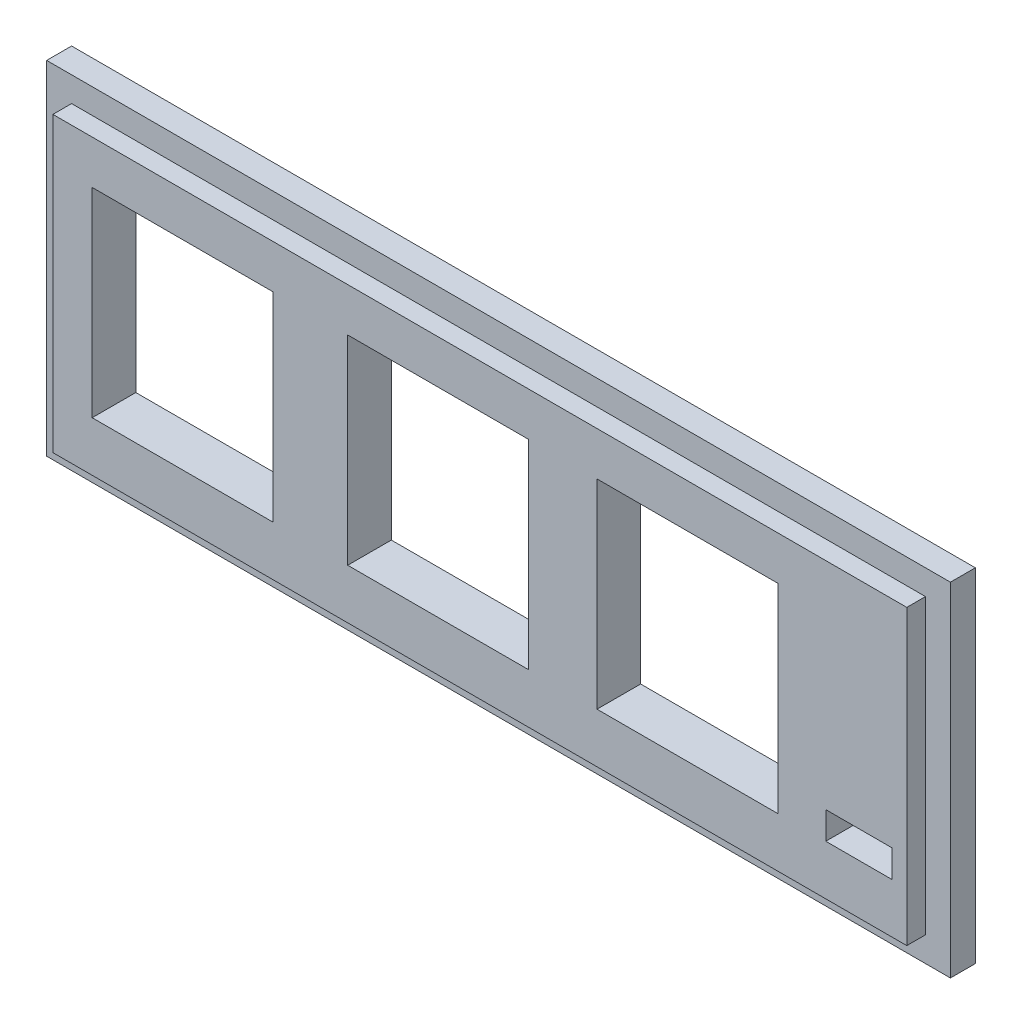
ISO-10303-21;
HEADER;
FILE_DESCRIPTION(('STEP AP214'),'2;1');
FILE_NAME('part.step','',(''),(''),'','','');
FILE_SCHEMA(('AUTOMOTIVE_DESIGN { 1 0 10303 214 1 1 1 1 }'));
ENDSEC;
DATA;
#1=APPLICATION_CONTEXT('core data for automotive mechanical design processes');
#2=APPLICATION_PROTOCOL_DEFINITION('international standard','automotive_design',2000,#1);
#3=PRODUCT_CONTEXT('',#1,'mechanical');
#4=PRODUCT('Part','Part','',(#3));
#5=PRODUCT_RELATED_PRODUCT_CATEGORY('part','',(#4));
#6=PRODUCT_DEFINITION_FORMATION('','',#4);
#7=PRODUCT_DEFINITION_CONTEXT('part definition',#1,'design');
#8=PRODUCT_DEFINITION('design','',#6,#7);
#9=PRODUCT_DEFINITION_SHAPE('','',#8);
#10=(LENGTH_UNIT() NAMED_UNIT(*) SI_UNIT(.MILLI.,.METRE.));
#11=(NAMED_UNIT(*) PLANE_ANGLE_UNIT() SI_UNIT($,.RADIAN.));
#12=(NAMED_UNIT(*) SI_UNIT($,.STERADIAN.) SOLID_ANGLE_UNIT());
#13=UNCERTAINTY_MEASURE_WITH_UNIT(LENGTH_MEASURE(1.E-05),#10,'distance_accuracy_value','');
#14=(GEOMETRIC_REPRESENTATION_CONTEXT(3) GLOBAL_UNCERTAINTY_ASSIGNED_CONTEXT((#13)) GLOBAL_UNIT_ASSIGNED_CONTEXT((#10,
#11,#12)) REPRESENTATION_CONTEXT('',''));
#15=CARTESIAN_POINT('',(0.,0.,0.));
#16=DIRECTION('',(0.,0.,1.));
#17=DIRECTION('',(1.,0.,0.));
#18=AXIS2_PLACEMENT_3D('',#15,#16,#17);
#19=CARTESIAN_POINT('',(0.,0.,0.));
#20=DIRECTION('',(0.,0.,1.));
#21=DIRECTION('',(1.,0.,0.));
#22=AXIS2_PLACEMENT_3D('',#19,#20,#21);
#23=PLANE('',#22);
#24=DIRECTION('',(0.,1.,0.));
#25=VECTOR('',#24,1.);
#26=CARTESIAN_POINT('',(-10.6,0.,0.));
#27=LINE('',#26,#25);
#28=CARTESIAN_POINT('',(-10.6,-7.75,0.));
#29=VERTEX_POINT('',#28);
#30=CARTESIAN_POINT('',(-10.6,8.24999999999999,0.));
#31=VERTEX_POINT('',#30);
#32=EDGE_CURVE('E231',#29,#31,#27,.T.);
#33=ORIENTED_EDGE('',*,*,#32,.F.);
#34=DIRECTION('',(1.,0.,0.));
#35=VECTOR('',#34,1.);
#36=CARTESIAN_POINT('',(0.,-7.75,0.));
#37=LINE('',#36,#35);
#38=CARTESIAN_POINT('',(3.9,-7.75,0.));
#39=VERTEX_POINT('',#38);
#40=EDGE_CURVE('E204',#29,#39,#37,.T.);
#41=ORIENTED_EDGE('',*,*,#40,.T.);
#42=DIRECTION('',(0.,1.,0.));
#43=VECTOR('',#42,1.);
#44=CARTESIAN_POINT('',(3.9,0.,0.));
#45=LINE('',#44,#43);
#46=CARTESIAN_POINT('',(3.9,8.25,0.));
#47=VERTEX_POINT('',#46);
#48=EDGE_CURVE('E235',#39,#47,#45,.T.);
#49=ORIENTED_EDGE('',*,*,#48,.T.);
#50=DIRECTION('',(-1.,0.,0.));
#51=VECTOR('',#50,1.);
#52=CARTESIAN_POINT('',(0.,8.25,0.));
#53=LINE('',#52,#51);
#54=EDGE_CURVE('E50',#47,#31,#53,.T.);
#55=ORIENTED_EDGE('',*,*,#54,.T.);
#56=EDGE_LOOP('',(#33,#41,#49,#55));
#57=FACE_BOUND('',#56,.T.);
#58=DIRECTION('',(0.,1.,0.));
#59=VECTOR('',#58,1.);
#60=CARTESIAN_POINT('',(9.4,0.,0.));
#61=LINE('',#60,#59);
#62=CARTESIAN_POINT('',(9.4,-7.75,0.));
#63=VERTEX_POINT('',#62);
#64=CARTESIAN_POINT('',(9.4,8.25,0.));
#65=VERTEX_POINT('',#64);
#66=EDGE_CURVE('E242',#63,#65,#61,.T.);
#67=ORIENTED_EDGE('',*,*,#66,.F.);
#68=DIRECTION('',(1.,0.,0.));
#69=VECTOR('',#68,1.);
#70=CARTESIAN_POINT('',(0.,-7.75,0.));
#71=LINE('',#70,#69);
#72=CARTESIAN_POINT('',(23.9,-7.75,0.));
#73=VERTEX_POINT('',#72);
#74=EDGE_CURVE('E253',#63,#73,#71,.T.);
#75=ORIENTED_EDGE('',*,*,#74,.T.);
#76=DIRECTION('',(0.,1.,0.));
#77=VECTOR('',#76,1.);
#78=CARTESIAN_POINT('',(23.9,0.,0.));
#79=LINE('',#78,#77);
#80=CARTESIAN_POINT('',(23.9,8.25,0.));
#81=VERTEX_POINT('',#80);
#82=EDGE_CURVE('E262',#73,#81,#79,.T.);
#83=ORIENTED_EDGE('',*,*,#82,.T.);
#84=DIRECTION('',(1.,0.,0.));
#85=VECTOR('',#84,1.);
#86=CARTESIAN_POINT('',(0.,8.25,0.));
#87=LINE('',#86,#85);
#88=EDGE_CURVE('E260',#65,#81,#87,.T.);
#89=ORIENTED_EDGE('',*,*,#88,.F.);
#90=EDGE_LOOP('',(#67,#75,#83,#89));
#91=FACE_BOUND('',#90,.T.);
#92=DIRECTION('',(0.,1.,0.));
#93=VECTOR('',#92,1.);
#94=CARTESIAN_POINT('',(-31.1,0.,0.));
#95=LINE('',#94,#93);
#96=CARTESIAN_POINT('',(-31.1,-7.75,0.));
#97=VERTEX_POINT('',#96);
#98=CARTESIAN_POINT('',(-31.1,8.24999999999999,0.));
#99=VERTEX_POINT('',#98);
#100=EDGE_CURVE('E298',#97,#99,#95,.T.);
#101=ORIENTED_EDGE('',*,*,#100,.F.);
#102=DIRECTION('',(1.,0.,0.));
#103=VECTOR('',#102,1.);
#104=CARTESIAN_POINT('',(0.,-7.75,0.));
#105=LINE('',#104,#103);
#106=CARTESIAN_POINT('',(-16.6,-7.75,0.));
#107=VERTEX_POINT('',#106);
#108=EDGE_CURVE('E300',#97,#107,#105,.T.);
#109=ORIENTED_EDGE('',*,*,#108,.T.);
#110=DIRECTION('',(0.,1.,0.));
#111=VECTOR('',#110,1.);
#112=CARTESIAN_POINT('',(-16.6,0.,0.));
#113=LINE('',#112,#111);
#114=CARTESIAN_POINT('',(-16.6,8.25,0.));
#115=VERTEX_POINT('',#114);
#116=EDGE_CURVE('E304',#107,#115,#113,.T.);
#117=ORIENTED_EDGE('',*,*,#116,.T.);
#118=DIRECTION('',(-1.,0.,0.));
#119=VECTOR('',#118,1.);
#120=CARTESIAN_POINT('',(0.,8.25,0.));
#121=LINE('',#120,#119);
#122=EDGE_CURVE('E307',#115,#99,#121,.T.);
#123=ORIENTED_EDGE('',*,*,#122,.T.);
#124=EDGE_LOOP('',(#101,#109,#117,#123));
#125=FACE_BOUND('',#124,.T.);
#126=DIRECTION('',(0.,1.,0.));
#127=VECTOR('',#126,1.);
#128=CARTESIAN_POINT('',(36.25,13.75,0.));
#129=LINE('',#128,#127);
#130=CARTESIAN_POINT('',(36.25,-13.75,0.));
#131=VERTEX_POINT('',#130);
#132=CARTESIAN_POINT('',(36.25,13.75,0.));
#133=VERTEX_POINT('',#132);
#134=EDGE_CURVE('E358',#131,#133,#129,.T.);
#135=ORIENTED_EDGE('',*,*,#134,.F.);
#136=DIRECTION('',(1.,0.,0.));
#137=VECTOR('',#136,1.);
#138=CARTESIAN_POINT('',(-36.25,-13.75,0.));
#139=LINE('',#138,#137);
#140=CARTESIAN_POINT('',(-36.25,-13.75,0.));
#141=VERTEX_POINT('',#140);
#142=EDGE_CURVE('E363',#141,#131,#139,.T.);
#143=ORIENTED_EDGE('',*,*,#142,.F.);
#144=DIRECTION('',(0.,-1.,0.));
#145=VECTOR('',#144,1.);
#146=CARTESIAN_POINT('',(-36.25,13.75,0.));
#147=LINE('',#146,#145);
#148=CARTESIAN_POINT('',(-36.25,13.75,0.));
#149=VERTEX_POINT('',#148);
#150=EDGE_CURVE('E374',#149,#141,#147,.T.);
#151=ORIENTED_EDGE('',*,*,#150,.F.);
#152=DIRECTION('',(-1.,0.,0.));
#153=VECTOR('',#152,1.);
#154=CARTESIAN_POINT('',(-36.25,13.75,0.));
#155=LINE('',#154,#153);
#156=EDGE_CURVE('E372',#133,#149,#155,.T.);
#157=ORIENTED_EDGE('',*,*,#156,.F.);
#158=EDGE_LOOP('',(#135,#143,#151,#157));
#159=FACE_BOUND('',#158,.T.);
#160=DIRECTION('',(0.,-1.,0.));
#161=VECTOR('',#160,1.);
#162=CARTESIAN_POINT('',(33.05,-5.55000000000004,0.));
#163=LINE('',#162,#161);
#164=CARTESIAN_POINT('',(33.05,-5.55000000000004,0.));
#165=VERTEX_POINT('',#164);
#166=CARTESIAN_POINT('',(33.05,-7.75000000000006,0.));
#167=VERTEX_POINT('',#166);
#168=EDGE_CURVE('E282',#165,#167,#163,.T.);
#169=ORIENTED_EDGE('',*,*,#168,.F.);
#170=DIRECTION('',(-1.,0.,0.));
#171=VECTOR('',#170,1.);
#172=CARTESIAN_POINT('',(33.05,-5.55000000000004,0.));
#173=LINE('',#172,#171);
#174=CARTESIAN_POINT('',(27.75,-5.55000000000004,0.));
#175=VERTEX_POINT('',#174);
#176=EDGE_CURVE('E277',#165,#175,#173,.T.);
#177=ORIENTED_EDGE('',*,*,#176,.T.);
#178=DIRECTION('',(0.,-1.,0.));
#179=VECTOR('',#178,1.);
#180=CARTESIAN_POINT('',(27.75,-5.55000000000004,0.));
#181=LINE('',#180,#179);
#182=CARTESIAN_POINT('',(27.75,-7.75000000000006,0.));
#183=VERTEX_POINT('',#182);
#184=EDGE_CURVE('E292',#175,#183,#181,.T.);
#185=ORIENTED_EDGE('',*,*,#184,.T.);
#186=DIRECTION('',(-1.,0.,0.));
#187=VECTOR('',#186,1.);
#188=CARTESIAN_POINT('',(33.05,-7.75000000000006,0.));
#189=LINE('',#188,#187);
#190=EDGE_CURVE('E295',#167,#183,#189,.T.);
#191=ORIENTED_EDGE('',*,*,#190,.F.);
#192=EDGE_LOOP('',(#169,#177,#185,#191));
#193=FACE_BOUND('',#192,.T.);
#194=ADVANCED_FACE('F35',(#57,#91,#125,#159,#193),#23,.F.);
#195=CARTESIAN_POINT('',(0.,0.,3.5));
#196=DIRECTION('',(0.,0.,1.));
#197=DIRECTION('',(1.,0.,0.));
#198=AXIS2_PLACEMENT_3D('',#195,#196,#197);
#199=PLANE('',#198);
#200=DIRECTION('',(1.,0.,0.));
#201=VECTOR('',#200,1.);
#202=CARTESIAN_POINT('',(0.,-7.75,3.5));
#203=LINE('',#202,#201);
#204=CARTESIAN_POINT('',(-10.6,-7.75,3.5));
#205=VERTEX_POINT('',#204);
#206=CARTESIAN_POINT('',(3.9,-7.75,3.5));
#207=VERTEX_POINT('',#206);
#208=EDGE_CURVE('E201',#205,#207,#203,.T.);
#209=ORIENTED_EDGE('',*,*,#208,.F.);
#210=DIRECTION('',(0.,1.,0.));
#211=VECTOR('',#210,1.);
#212=CARTESIAN_POINT('',(-10.6,0.,3.5));
#213=LINE('',#212,#211);
#214=CARTESIAN_POINT('',(-10.6,8.24999999999999,3.5));
#215=VERTEX_POINT('',#214);
#216=EDGE_CURVE('E211',#205,#215,#213,.T.);
#217=ORIENTED_EDGE('',*,*,#216,.T.);
#218=DIRECTION('',(-1.,0.,0.));
#219=VECTOR('',#218,1.);
#220=CARTESIAN_POINT('',(0.,8.25,3.5));
#221=LINE('',#220,#219);
#222=CARTESIAN_POINT('',(3.9,8.25,3.5));
#223=VERTEX_POINT('',#222);
#224=EDGE_CURVE('E216',#223,#215,#221,.T.);
#225=ORIENTED_EDGE('',*,*,#224,.F.);
#226=DIRECTION('',(0.,1.,0.));
#227=VECTOR('',#226,1.);
#228=CARTESIAN_POINT('',(3.9,0.,3.5));
#229=LINE('',#228,#227);
#230=EDGE_CURVE('E222',#207,#223,#229,.T.);
#231=ORIENTED_EDGE('',*,*,#230,.F.);
#232=EDGE_LOOP('',(#209,#217,#225,#231));
#233=FACE_BOUND('',#232,.T.);
#234=DIRECTION('',(1.,0.,0.));
#235=VECTOR('',#234,1.);
#236=CARTESIAN_POINT('',(0.,-7.75,3.5));
#237=LINE('',#236,#235);
#238=CARTESIAN_POINT('',(9.4,-7.75,3.5));
#239=VERTEX_POINT('',#238);
#240=CARTESIAN_POINT('',(23.9,-7.75,3.5));
#241=VERTEX_POINT('',#240);
#242=EDGE_CURVE('E208',#239,#241,#237,.T.);
#243=ORIENTED_EDGE('',*,*,#242,.F.);
#244=DIRECTION('',(0.,1.,0.));
#245=VECTOR('',#244,1.);
#246=CARTESIAN_POINT('',(9.4,0.,3.5));
#247=LINE('',#246,#245);
#248=CARTESIAN_POINT('',(9.4,8.25,3.5));
#249=VERTEX_POINT('',#248);
#250=EDGE_CURVE('E249',#239,#249,#247,.T.);
#251=ORIENTED_EDGE('',*,*,#250,.T.);
#252=DIRECTION('',(1.,0.,0.));
#253=VECTOR('',#252,1.);
#254=CARTESIAN_POINT('',(0.,8.25,3.5));
#255=LINE('',#254,#253);
#256=CARTESIAN_POINT('',(23.9,8.25,3.5));
#257=VERTEX_POINT('',#256);
#258=EDGE_CURVE('E252',#249,#257,#255,.T.);
#259=ORIENTED_EDGE('',*,*,#258,.T.);
#260=DIRECTION('',(0.,1.,0.));
#261=VECTOR('',#260,1.);
#262=CARTESIAN_POINT('',(23.9,0.,3.5));
#263=LINE('',#262,#261);
#264=EDGE_CURVE('E256',#241,#257,#263,.T.);
#265=ORIENTED_EDGE('',*,*,#264,.F.);
#266=EDGE_LOOP('',(#243,#251,#259,#265));
#267=FACE_BOUND('',#266,.T.);
#268=DIRECTION('',(1.,0.,0.));
#269=VECTOR('',#268,1.);
#270=CARTESIAN_POINT('',(0.,11.75,3.5));
#271=LINE('',#270,#269);
#272=CARTESIAN_POINT('',(-34.25,11.75,3.5));
#273=VERTEX_POINT('',#272);
#274=CARTESIAN_POINT('',(34.25,11.75,3.5));
#275=VERTEX_POINT('',#274);
#276=EDGE_CURVE('E327',#273,#275,#271,.T.);
#277=ORIENTED_EDGE('',*,*,#276,.F.);
#278=DIRECTION('',(0.,-1.,0.));
#279=VECTOR('',#278,1.);
#280=CARTESIAN_POINT('',(-34.25,0.,3.5));
#281=LINE('',#280,#279);
#282=CARTESIAN_POINT('',(-34.25,-11.75,3.5));
#283=VERTEX_POINT('',#282);
#284=EDGE_CURVE('E330',#273,#283,#281,.T.);
#285=ORIENTED_EDGE('',*,*,#284,.T.);
#286=DIRECTION('',(1.,0.,0.));
#287=VECTOR('',#286,1.);
#288=CARTESIAN_POINT('',(0.,-11.75,3.5));
#289=LINE('',#288,#287);
#290=CARTESIAN_POINT('',(34.25,-11.75,3.5));
#291=VERTEX_POINT('',#290);
#292=EDGE_CURVE('E333',#283,#291,#289,.T.);
#293=ORIENTED_EDGE('',*,*,#292,.T.);
#294=DIRECTION('',(0.,-1.,0.));
#295=VECTOR('',#294,1.);
#296=CARTESIAN_POINT('',(34.25,0.,3.5));
#297=LINE('',#296,#295);
#298=EDGE_CURVE('E335',#275,#291,#297,.T.);
#299=ORIENTED_EDGE('',*,*,#298,.F.);
#300=EDGE_LOOP('',(#277,#285,#293,#299));
#301=FACE_BOUND('',#300,.T.);
#302=DIRECTION('',(1.,0.,0.));
#303=VECTOR('',#302,1.);
#304=CARTESIAN_POINT('',(0.,-7.75,3.5));
#305=LINE('',#304,#303);
#306=CARTESIAN_POINT('',(-31.1,-7.75,3.5));
#307=VERTEX_POINT('',#306);
#308=CARTESIAN_POINT('',(-16.6,-7.75,3.5));
#309=VERTEX_POINT('',#308);
#310=EDGE_CURVE('E226',#307,#309,#305,.T.);
#311=ORIENTED_EDGE('',*,*,#310,.F.);
#312=DIRECTION('',(0.,1.,0.));
#313=VECTOR('',#312,1.);
#314=CARTESIAN_POINT('',(-31.1,0.,3.5));
#315=LINE('',#314,#313);
#316=CARTESIAN_POINT('',(-31.1,8.24999999999999,3.5));
#317=VERTEX_POINT('',#316);
#318=EDGE_CURVE('E223',#307,#317,#315,.T.);
#319=ORIENTED_EDGE('',*,*,#318,.T.);
#320=DIRECTION('',(-1.,0.,0.));
#321=VECTOR('',#320,1.);
#322=CARTESIAN_POINT('',(0.,8.25,3.5));
#323=LINE('',#322,#321);
#324=CARTESIAN_POINT('',(-16.6,8.25,3.5));
#325=VERTEX_POINT('',#324);
#326=EDGE_CURVE('E301',#325,#317,#323,.T.);
#327=ORIENTED_EDGE('',*,*,#326,.F.);
#328=DIRECTION('',(0.,1.,0.));
#329=VECTOR('',#328,1.);
#330=CARTESIAN_POINT('',(-16.6,0.,3.5));
#331=LINE('',#330,#329);
#332=EDGE_CURVE('E313',#309,#325,#331,.T.);
#333=ORIENTED_EDGE('',*,*,#332,.F.);
#334=EDGE_LOOP('',(#311,#319,#327,#333));
#335=FACE_BOUND('',#334,.T.);
#336=DIRECTION('',(-1.,0.,0.));
#337=VECTOR('',#336,1.);
#338=CARTESIAN_POINT('',(33.05,-5.55000000000004,3.5));
#339=LINE('',#338,#337);
#340=CARTESIAN_POINT('',(33.05,-5.55000000000004,3.5));
#341=VERTEX_POINT('',#340);
#342=CARTESIAN_POINT('',(27.75,-5.55000000000004,3.5));
#343=VERTEX_POINT('',#342);
#344=EDGE_CURVE('E278',#341,#343,#339,.T.);
#345=ORIENTED_EDGE('',*,*,#344,.F.);
#346=DIRECTION('',(0.,-1.,0.));
#347=VECTOR('',#346,1.);
#348=CARTESIAN_POINT('',(33.05,-5.55000000000004,3.5));
#349=LINE('',#348,#347);
#350=CARTESIAN_POINT('',(33.05,-7.75000000000006,3.5));
#351=VERTEX_POINT('',#350);
#352=EDGE_CURVE('E248',#341,#351,#349,.T.);
#353=ORIENTED_EDGE('',*,*,#352,.T.);
#354=DIRECTION('',(-1.,0.,0.));
#355=VECTOR('',#354,1.);
#356=CARTESIAN_POINT('',(33.05,-7.75000000000006,3.5));
#357=LINE('',#356,#355);
#358=CARTESIAN_POINT('',(27.75,-7.75000000000006,3.5));
#359=VERTEX_POINT('',#358);
#360=EDGE_CURVE('E285',#351,#359,#357,.T.);
#361=ORIENTED_EDGE('',*,*,#360,.T.);
#362=DIRECTION('',(0.,-1.,0.));
#363=VECTOR('',#362,1.);
#364=CARTESIAN_POINT('',(27.75,-5.55000000000004,3.5));
#365=LINE('',#364,#363);
#366=EDGE_CURVE('E281',#343,#359,#365,.T.);
#367=ORIENTED_EDGE('',*,*,#366,.F.);
#368=EDGE_LOOP('',(#345,#353,#361,#367));
#369=FACE_BOUND('',#368,.T.);
#370=ADVANCED_FACE('F219',(#233,#267,#301,#335,#369),#199,.T.);
#371=CARTESIAN_POINT('',(36.25,13.75,2.));
#372=DIRECTION('',(-1.,0.,0.));
#373=DIRECTION('',(0.,-1.,0.));
#374=AXIS2_PLACEMENT_3D('',#371,#372,#373);
#375=PLANE('',#374);
#376=ORIENTED_EDGE('',*,*,#134,.T.);
#377=DIRECTION('',(0.,0.,-1.));
#378=VECTOR('',#377,1.);
#379=CARTESIAN_POINT('',(36.25,13.75,2.));
#380=LINE('',#379,#378);
#381=CARTESIAN_POINT('',(36.25,13.75,2.));
#382=VERTEX_POINT('',#381);
#383=EDGE_CURVE('E11',#382,#133,#380,.T.);
#384=ORIENTED_EDGE('',*,*,#383,.F.);
#385=DIRECTION('',(0.,1.,0.));
#386=VECTOR('',#385,1.);
#387=CARTESIAN_POINT('',(36.25,13.75,2.));
#388=LINE('',#387,#386);
#389=CARTESIAN_POINT('',(36.25,-13.75,2.));
#390=VERTEX_POINT('',#389);
#391=EDGE_CURVE('E359',#390,#382,#388,.T.);
#392=ORIENTED_EDGE('',*,*,#391,.F.);
#393=DIRECTION('',(0.,0.,-1.));
#394=VECTOR('',#393,1.);
#395=CARTESIAN_POINT('',(36.25,-13.75,2.));
#396=LINE('',#395,#394);
#397=EDGE_CURVE('E369',#390,#131,#396,.T.);
#398=ORIENTED_EDGE('',*,*,#397,.T.);
#399=EDGE_LOOP('',(#376,#384,#392,#398));
#400=FACE_BOUND('',#399,.T.);
#401=ADVANCED_FACE('F37',(#400),#375,.F.);
#402=CARTESIAN_POINT('',(-36.25,13.75,2.));
#403=DIRECTION('',(0.,-1.,0.));
#404=DIRECTION('',(0.,0.,-1.));
#405=AXIS2_PLACEMENT_3D('',#402,#403,#404);
#406=PLANE('',#405);
#407=ORIENTED_EDGE('',*,*,#156,.T.);
#408=DIRECTION('',(0.,0.,-1.));
#409=VECTOR('',#408,1.);
#410=CARTESIAN_POINT('',(-36.25,13.75,2.));
#411=LINE('',#410,#409);
#412=CARTESIAN_POINT('',(-36.25,13.75,2.));
#413=VERTEX_POINT('',#412);
#414=EDGE_CURVE('E43',#413,#149,#411,.T.);
#415=ORIENTED_EDGE('',*,*,#414,.F.);
#416=DIRECTION('',(-1.,0.,0.));
#417=VECTOR('',#416,1.);
#418=CARTESIAN_POINT('',(-36.25,13.75,2.));
#419=LINE('',#418,#417);
#420=EDGE_CURVE('E362',#382,#413,#419,.T.);
#421=ORIENTED_EDGE('',*,*,#420,.F.);
#422=ORIENTED_EDGE('',*,*,#383,.T.);
#423=EDGE_LOOP('',(#407,#415,#421,#422));
#424=FACE_BOUND('',#423,.T.);
#425=ADVANCED_FACE('F402',(#424),#406,.F.);
#426=CARTESIAN_POINT('',(-36.25,13.75,2.));
#427=DIRECTION('',(1.,0.,0.));
#428=DIRECTION('',(0.,1.,0.));
#429=AXIS2_PLACEMENT_3D('',#426,#427,#428);
#430=PLANE('',#429);
#431=ORIENTED_EDGE('',*,*,#150,.T.);
#432=DIRECTION('',(0.,0.,-1.));
#433=VECTOR('',#432,1.);
#434=CARTESIAN_POINT('',(-36.25,-13.75,2.));
#435=LINE('',#434,#433);
#436=CARTESIAN_POINT('',(-36.25,-13.75,2.));
#437=VERTEX_POINT('',#436);
#438=EDGE_CURVE('E379',#437,#141,#435,.T.);
#439=ORIENTED_EDGE('',*,*,#438,.F.);
#440=DIRECTION('',(0.,-1.,0.));
#441=VECTOR('',#440,1.);
#442=CARTESIAN_POINT('',(-36.25,13.75,2.));
#443=LINE('',#442,#441);
#444=EDGE_CURVE('E365',#413,#437,#443,.T.);
#445=ORIENTED_EDGE('',*,*,#444,.F.);
#446=ORIENTED_EDGE('',*,*,#414,.T.);
#447=EDGE_LOOP('',(#431,#439,#445,#446));
#448=FACE_BOUND('',#447,.T.);
#449=ADVANCED_FACE('F386',(#448),#430,.F.);
#450=CARTESIAN_POINT('',(-36.25,-13.75,2.));
#451=DIRECTION('',(0.,1.,0.));
#452=DIRECTION('',(0.,0.,1.));
#453=AXIS2_PLACEMENT_3D('',#450,#451,#452);
#454=PLANE('',#453);
#455=ORIENTED_EDGE('',*,*,#142,.T.);
#456=ORIENTED_EDGE('',*,*,#397,.F.);
#457=DIRECTION('',(1.,0.,0.));
#458=VECTOR('',#457,1.);
#459=CARTESIAN_POINT('',(-36.25,-13.75,2.));
#460=LINE('',#459,#458);
#461=EDGE_CURVE('E367',#437,#390,#460,.T.);
#462=ORIENTED_EDGE('',*,*,#461,.F.);
#463=ORIENTED_EDGE('',*,*,#438,.T.);
#464=EDGE_LOOP('',(#455,#456,#462,#463));
#465=FACE_BOUND('',#464,.T.);
#466=ADVANCED_FACE('F395',(#465),#454,.F.);
#467=CARTESIAN_POINT('',(0.,0.,2.));
#468=DIRECTION('',(0.,0.,1.));
#469=DIRECTION('',(1.,0.,0.));
#470=AXIS2_PLACEMENT_3D('',#467,#468,#469);
#471=PLANE('',#470);
#472=DIRECTION('',(1.,0.,0.));
#473=VECTOR('',#472,1.);
#474=CARTESIAN_POINT('',(0.,11.75,2.));
#475=LINE('',#474,#473);
#476=CARTESIAN_POINT('',(-34.25,11.75,2.));
#477=VERTEX_POINT('',#476);
#478=CARTESIAN_POINT('',(34.25,11.75,2.));
#479=VERTEX_POINT('',#478);
#480=EDGE_CURVE('E320',#477,#479,#475,.T.);
#481=ORIENTED_EDGE('',*,*,#480,.T.);
#482=DIRECTION('',(0.,-1.,0.));
#483=VECTOR('',#482,1.);
#484=CARTESIAN_POINT('',(34.25,0.,2.));
#485=LINE('',#484,#483);
#486=CARTESIAN_POINT('',(34.25,-11.75,2.));
#487=VERTEX_POINT('',#486);
#488=EDGE_CURVE('E331',#479,#487,#485,.T.);
#489=ORIENTED_EDGE('',*,*,#488,.T.);
#490=DIRECTION('',(1.,0.,0.));
#491=VECTOR('',#490,1.);
#492=CARTESIAN_POINT('',(0.,-11.75,2.));
#493=LINE('',#492,#491);
#494=CARTESIAN_POINT('',(-34.25,-11.75,2.));
#495=VERTEX_POINT('',#494);
#496=EDGE_CURVE('E343',#495,#487,#493,.T.);
#497=ORIENTED_EDGE('',*,*,#496,.F.);
#498=DIRECTION('',(0.,-1.,0.));
#499=VECTOR('',#498,1.);
#500=CARTESIAN_POINT('',(-34.25,0.,2.));
#501=LINE('',#500,#499);
#502=EDGE_CURVE('E340',#477,#495,#501,.T.);
#503=ORIENTED_EDGE('',*,*,#502,.F.);
#504=EDGE_LOOP('',(#481,#489,#497,#503));
#505=FACE_BOUND('',#504,.T.);
#506=ORIENTED_EDGE('',*,*,#391,.T.);
#507=ORIENTED_EDGE('',*,*,#420,.T.);
#508=ORIENTED_EDGE('',*,*,#444,.T.);
#509=ORIENTED_EDGE('',*,*,#461,.T.);
#510=EDGE_LOOP('',(#506,#507,#508,#509));
#511=FACE_BOUND('',#510,.T.);
#512=ADVANCED_FACE('F401',(#505,#511),#471,.T.);
#513=CARTESIAN_POINT('',(0.,11.75,3.5));
#514=DIRECTION('',(0.,1.,0.));
#515=DIRECTION('',(0.,0.,1.));
#516=AXIS2_PLACEMENT_3D('',#513,#514,#515);
#517=PLANE('',#516);
#518=ORIENTED_EDGE('',*,*,#480,.F.);
#519=DIRECTION('',(0.,0.,-1.));
#520=VECTOR('',#519,1.);
#521=CARTESIAN_POINT('',(-34.25,11.75,3.5));
#522=LINE('',#521,#520);
#523=EDGE_CURVE('E355',#273,#477,#522,.T.);
#524=ORIENTED_EDGE('',*,*,#523,.F.);
#525=ORIENTED_EDGE('',*,*,#276,.T.);
#526=DIRECTION('',(0.,0.,-1.));
#527=VECTOR('',#526,1.);
#528=CARTESIAN_POINT('',(34.25,11.75,3.5));
#529=LINE('',#528,#527);
#530=EDGE_CURVE('E338',#275,#479,#529,.T.);
#531=ORIENTED_EDGE('',*,*,#530,.T.);
#532=EDGE_LOOP('',(#518,#524,#525,#531));
#533=FACE_BOUND('',#532,.T.);
#534=ADVANCED_FACE('F426',(#533),#517,.T.);
#535=CARTESIAN_POINT('',(-34.25,0.,3.5));
#536=DIRECTION('',(1.,0.,0.));
#537=DIRECTION('',(0.,0.,-1.));
#538=AXIS2_PLACEMENT_3D('',#535,#536,#537);
#539=PLANE('',#538);
#540=ORIENTED_EDGE('',*,*,#502,.T.);
#541=DIRECTION('',(0.,0.,-1.));
#542=VECTOR('',#541,1.);
#543=CARTESIAN_POINT('',(-34.25,-11.75,3.5));
#544=LINE('',#543,#542);
#545=EDGE_CURVE('E352',#283,#495,#544,.T.);
#546=ORIENTED_EDGE('',*,*,#545,.F.);
#547=ORIENTED_EDGE('',*,*,#284,.F.);
#548=ORIENTED_EDGE('',*,*,#523,.T.);
#549=EDGE_LOOP('',(#540,#546,#547,#548));
#550=FACE_BOUND('',#549,.T.);
#551=ADVANCED_FACE('F431',(#550),#539,.F.);
#552=CARTESIAN_POINT('',(0.,-11.75,3.5));
#553=DIRECTION('',(0.,1.,0.));
#554=DIRECTION('',(-1.,0.,0.));
#555=AXIS2_PLACEMENT_3D('',#552,#553,#554);
#556=PLANE('',#555);
#557=ORIENTED_EDGE('',*,*,#496,.T.);
#558=DIRECTION('',(0.,0.,-1.));
#559=VECTOR('',#558,1.);
#560=CARTESIAN_POINT('',(34.25,-11.75,3.5));
#561=LINE('',#560,#559);
#562=EDGE_CURVE('E349',#291,#487,#561,.T.);
#563=ORIENTED_EDGE('',*,*,#562,.F.);
#564=ORIENTED_EDGE('',*,*,#292,.F.);
#565=ORIENTED_EDGE('',*,*,#545,.T.);
#566=EDGE_LOOP('',(#557,#563,#564,#565));
#567=FACE_BOUND('',#566,.T.);
#568=ADVANCED_FACE('F442',(#567),#556,.F.);
#569=CARTESIAN_POINT('',(34.25,0.,3.5));
#570=DIRECTION('',(1.,0.,0.));
#571=DIRECTION('',(0.,0.,-1.));
#572=AXIS2_PLACEMENT_3D('',#569,#570,#571);
#573=PLANE('',#572);
#574=ORIENTED_EDGE('',*,*,#488,.F.);
#575=ORIENTED_EDGE('',*,*,#530,.F.);
#576=ORIENTED_EDGE('',*,*,#298,.T.);
#577=ORIENTED_EDGE('',*,*,#562,.T.);
#578=EDGE_LOOP('',(#574,#575,#576,#577));
#579=FACE_BOUND('',#578,.T.);
#580=ADVANCED_FACE('F438',(#579),#573,.T.);
#581=CARTESIAN_POINT('',(-31.1,0.,0.));
#582=DIRECTION('',(1.,0.,0.));
#583=DIRECTION('',(0.,0.,-1.));
#584=AXIS2_PLACEMENT_3D('',#581,#582,#583);
#585=PLANE('',#584);
#586=ORIENTED_EDGE('',*,*,#318,.F.);
#587=DIRECTION('',(0.,0.,1.));
#588=VECTOR('',#587,1.);
#589=CARTESIAN_POINT('',(-31.1,-7.75,0.));
#590=LINE('',#589,#588);
#591=EDGE_CURVE('E309',#97,#307,#590,.T.);
#592=ORIENTED_EDGE('',*,*,#591,.F.);
#593=ORIENTED_EDGE('',*,*,#100,.T.);
#594=DIRECTION('',(0.,0.,1.));
#595=VECTOR('',#594,1.);
#596=CARTESIAN_POINT('',(-31.1,8.24999999999999,0.));
#597=LINE('',#596,#595);
#598=EDGE_CURVE('E318',#99,#317,#597,.T.);
#599=ORIENTED_EDGE('',*,*,#598,.T.);
#600=EDGE_LOOP('',(#586,#592,#593,#599));
#601=FACE_BOUND('',#600,.T.);
#602=ADVANCED_FACE('F482',(#601),#585,.T.);
#603=CARTESIAN_POINT('',(0.,8.25,0.));
#604=DIRECTION('',(0.,1.,0.));
#605=DIRECTION('',(-1.,0.,0.));
#606=AXIS2_PLACEMENT_3D('',#603,#604,#605);
#607=PLANE('',#606);
#608=ORIENTED_EDGE('',*,*,#326,.T.);
#609=ORIENTED_EDGE('',*,*,#598,.F.);
#610=ORIENTED_EDGE('',*,*,#122,.F.);
#611=DIRECTION('',(0.,0.,1.));
#612=VECTOR('',#611,1.);
#613=CARTESIAN_POINT('',(-16.6,8.25,0.));
#614=LINE('',#613,#612);
#615=EDGE_CURVE('E321',#115,#325,#614,.T.);
#616=ORIENTED_EDGE('',*,*,#615,.T.);
#617=EDGE_LOOP('',(#608,#609,#610,#616));
#618=FACE_BOUND('',#617,.T.);
#619=ADVANCED_FACE('F478',(#618),#607,.F.);
#620=CARTESIAN_POINT('',(-16.6,0.,0.));
#621=DIRECTION('',(1.,0.,0.));
#622=DIRECTION('',(0.,0.,-1.));
#623=AXIS2_PLACEMENT_3D('',#620,#621,#622);
#624=PLANE('',#623);
#625=ORIENTED_EDGE('',*,*,#332,.T.);
#626=ORIENTED_EDGE('',*,*,#615,.F.);
#627=ORIENTED_EDGE('',*,*,#116,.F.);
#628=DIRECTION('',(0.,0.,1.));
#629=VECTOR('',#628,1.);
#630=CARTESIAN_POINT('',(-16.6,-7.75,0.));
#631=LINE('',#630,#629);
#632=EDGE_CURVE('E323',#107,#309,#631,.T.);
#633=ORIENTED_EDGE('',*,*,#632,.T.);
#634=EDGE_LOOP('',(#625,#626,#627,#633));
#635=FACE_BOUND('',#634,.T.);
#636=ADVANCED_FACE('F481',(#635),#624,.F.);
#637=CARTESIAN_POINT('',(0.,-7.75,0.));
#638=DIRECTION('',(0.,-1.,0.));
#639=DIRECTION('',(0.,0.,-1.));
#640=AXIS2_PLACEMENT_3D('',#637,#638,#639);
#641=PLANE('',#640);
#642=ORIENTED_EDGE('',*,*,#310,.T.);
#643=ORIENTED_EDGE('',*,*,#632,.F.);
#644=ORIENTED_EDGE('',*,*,#108,.F.);
#645=ORIENTED_EDGE('',*,*,#591,.T.);
#646=EDGE_LOOP('',(#642,#643,#644,#645));
#647=FACE_BOUND('',#646,.T.);
#648=ADVANCED_FACE('F486',(#647),#641,.F.);
#649=CARTESIAN_POINT('',(33.05,-5.55000000000004,0.));
#650=DIRECTION('',(-1.,0.,0.));
#651=DIRECTION('',(0.,0.,1.));
#652=AXIS2_PLACEMENT_3D('',#649,#650,#651);
#653=PLANE('',#652);
#654=ORIENTED_EDGE('',*,*,#352,.F.);
#655=DIRECTION('',(0.,0.,1.));
#656=VECTOR('',#655,1.);
#657=CARTESIAN_POINT('',(33.05,-5.55000000000004,0.));
#658=LINE('',#657,#656);
#659=EDGE_CURVE('E274',#165,#341,#658,.T.);
#660=ORIENTED_EDGE('',*,*,#659,.F.);
#661=ORIENTED_EDGE('',*,*,#168,.T.);
#662=DIRECTION('',(0.,0.,1.));
#663=VECTOR('',#662,1.);
#664=CARTESIAN_POINT('',(33.05,-7.75000000000006,0.));
#665=LINE('',#664,#663);
#666=EDGE_CURVE('E267',#167,#351,#665,.T.);
#667=ORIENTED_EDGE('',*,*,#666,.T.);
#668=EDGE_LOOP('',(#654,#660,#661,#667));
#669=FACE_BOUND('',#668,.T.);
#670=ADVANCED_FACE('F459',(#669),#653,.T.);
#671=CARTESIAN_POINT('',(33.05,-7.75000000000006,0.));
#672=DIRECTION('',(0.,1.,0.));
#673=DIRECTION('',(-1.,0.,0.));
#674=AXIS2_PLACEMENT_3D('',#671,#672,#673);
#675=PLANE('',#674);
#676=ORIENTED_EDGE('',*,*,#360,.F.);
#677=ORIENTED_EDGE('',*,*,#666,.F.);
#678=ORIENTED_EDGE('',*,*,#190,.T.);
#679=DIRECTION('',(0.,0.,1.));
#680=VECTOR('',#679,1.);
#681=CARTESIAN_POINT('',(27.75,-7.75000000000006,0.));
#682=LINE('',#681,#680);
#683=EDGE_CURVE('E270',#183,#359,#682,.T.);
#684=ORIENTED_EDGE('',*,*,#683,.T.);
#685=EDGE_LOOP('',(#676,#677,#678,#684));
#686=FACE_BOUND('',#685,.T.);
#687=ADVANCED_FACE('F463',(#686),#675,.T.);
#688=CARTESIAN_POINT('',(27.75,-5.55000000000004,0.));
#689=DIRECTION('',(-1.,0.,0.));
#690=DIRECTION('',(0.,0.,1.));
#691=AXIS2_PLACEMENT_3D('',#688,#689,#690);
#692=PLANE('',#691);
#693=ORIENTED_EDGE('',*,*,#366,.T.);
#694=ORIENTED_EDGE('',*,*,#683,.F.);
#695=ORIENTED_EDGE('',*,*,#184,.F.);
#696=DIRECTION('',(0.,0.,1.));
#697=VECTOR('',#696,1.);
#698=CARTESIAN_POINT('',(27.75,-5.55000000000004,0.));
#699=LINE('',#698,#697);
#700=EDGE_CURVE('E272',#175,#343,#699,.T.);
#701=ORIENTED_EDGE('',*,*,#700,.T.);
#702=EDGE_LOOP('',(#693,#694,#695,#701));
#703=FACE_BOUND('',#702,.T.);
#704=ADVANCED_FACE('F466',(#703),#692,.F.);
#705=CARTESIAN_POINT('',(33.05,-5.55000000000004,0.));
#706=DIRECTION('',(0.,1.,0.));
#707=DIRECTION('',(0.,0.,1.));
#708=AXIS2_PLACEMENT_3D('',#705,#706,#707);
#709=PLANE('',#708);
#710=ORIENTED_EDGE('',*,*,#344,.T.);
#711=ORIENTED_EDGE('',*,*,#700,.F.);
#712=ORIENTED_EDGE('',*,*,#176,.F.);
#713=ORIENTED_EDGE('',*,*,#659,.T.);
#714=EDGE_LOOP('',(#710,#711,#712,#713));
#715=FACE_BOUND('',#714,.T.);
#716=ADVANCED_FACE('F455',(#715),#709,.F.);
#717=CARTESIAN_POINT('',(0.,-7.75,0.));
#718=DIRECTION('',(0.,-1.,0.));
#719=DIRECTION('',(0.,0.,-1.));
#720=AXIS2_PLACEMENT_3D('',#717,#718,#719);
#721=PLANE('',#720);
#722=ORIENTED_EDGE('',*,*,#242,.T.);
#723=DIRECTION('',(0.,0.,1.));
#724=VECTOR('',#723,1.);
#725=CARTESIAN_POINT('',(23.9,-7.75,0.));
#726=LINE('',#725,#724);
#727=EDGE_CURVE('E239',#73,#241,#726,.T.);
#728=ORIENTED_EDGE('',*,*,#727,.F.);
#729=ORIENTED_EDGE('',*,*,#74,.F.);
#730=DIRECTION('',(0.,0.,1.));
#731=VECTOR('',#730,1.);
#732=CARTESIAN_POINT('',(9.4,-7.75,0.));
#733=LINE('',#732,#731);
#734=EDGE_CURVE('E246',#63,#239,#733,.T.);
#735=ORIENTED_EDGE('',*,*,#734,.T.);
#736=EDGE_LOOP('',(#722,#728,#729,#735));
#737=FACE_BOUND('',#736,.T.);
#738=ADVANCED_FACE('F473',(#737),#721,.F.);
#739=CARTESIAN_POINT('',(9.4,0.,0.));
#740=DIRECTION('',(1.,0.,0.));
#741=DIRECTION('',(0.,0.,-1.));
#742=AXIS2_PLACEMENT_3D('',#739,#740,#741);
#743=PLANE('',#742);
#744=ORIENTED_EDGE('',*,*,#250,.F.);
#745=ORIENTED_EDGE('',*,*,#734,.F.);
#746=ORIENTED_EDGE('',*,*,#66,.T.);
#747=DIRECTION('',(0.,0.,1.));
#748=VECTOR('',#747,1.);
#749=CARTESIAN_POINT('',(9.4,8.25,0.));
#750=LINE('',#749,#748);
#751=EDGE_CURVE('E244',#65,#249,#750,.T.);
#752=ORIENTED_EDGE('',*,*,#751,.T.);
#753=EDGE_LOOP('',(#744,#745,#746,#752));
#754=FACE_BOUND('',#753,.T.);
#755=ADVANCED_FACE('F564',(#754),#743,.T.);
#756=CARTESIAN_POINT('',(0.,8.25,0.));
#757=DIRECTION('',(0.,-1.,0.));
#758=DIRECTION('',(0.,0.,-1.));
#759=AXIS2_PLACEMENT_3D('',#756,#757,#758);
#760=PLANE('',#759);
#761=ORIENTED_EDGE('',*,*,#258,.F.);
#762=ORIENTED_EDGE('',*,*,#751,.F.);
#763=ORIENTED_EDGE('',*,*,#88,.T.);
#764=DIRECTION('',(0.,0.,1.));
#765=VECTOR('',#764,1.);
#766=CARTESIAN_POINT('',(23.9,8.25,0.));
#767=LINE('',#766,#765);
#768=EDGE_CURVE('E58',#81,#257,#767,.T.);
#769=ORIENTED_EDGE('',*,*,#768,.T.);
#770=EDGE_LOOP('',(#761,#762,#763,#769));
#771=FACE_BOUND('',#770,.T.);
#772=ADVANCED_FACE('F574',(#771),#760,.T.);
#773=CARTESIAN_POINT('',(23.9,0.,0.));
#774=DIRECTION('',(1.,0.,0.));
#775=DIRECTION('',(0.,0.,-1.));
#776=AXIS2_PLACEMENT_3D('',#773,#774,#775);
#777=PLANE('',#776);
#778=ORIENTED_EDGE('',*,*,#264,.T.);
#779=ORIENTED_EDGE('',*,*,#768,.F.);
#780=ORIENTED_EDGE('',*,*,#82,.F.);
#781=ORIENTED_EDGE('',*,*,#727,.T.);
#782=EDGE_LOOP('',(#778,#779,#780,#781));
#783=FACE_BOUND('',#782,.T.);
#784=ADVANCED_FACE('F584',(#783),#777,.F.);
#785=CARTESIAN_POINT('',(0.,-7.75,0.));
#786=DIRECTION('',(0.,-1.,0.));
#787=DIRECTION('',(0.,0.,-1.));
#788=AXIS2_PLACEMENT_3D('',#785,#786,#787);
#789=PLANE('',#788);
#790=ORIENTED_EDGE('',*,*,#208,.T.);
#791=DIRECTION('',(0.,0.,1.));
#792=VECTOR('',#791,1.);
#793=CARTESIAN_POINT('',(3.9,-7.75,0.));
#794=LINE('',#793,#792);
#795=EDGE_CURVE('E233',#39,#207,#794,.T.);
#796=ORIENTED_EDGE('',*,*,#795,.F.);
#797=ORIENTED_EDGE('',*,*,#40,.F.);
#798=DIRECTION('',(0.,0.,1.));
#799=VECTOR('',#798,1.);
#800=CARTESIAN_POINT('',(-10.6,-7.75,0.));
#801=LINE('',#800,#799);
#802=EDGE_CURVE('E197',#29,#205,#801,.T.);
#803=ORIENTED_EDGE('',*,*,#802,.T.);
#804=EDGE_LOOP('',(#790,#796,#797,#803));
#805=FACE_BOUND('',#804,.T.);
#806=ADVANCED_FACE('F199',(#805),#789,.F.);
#807=CARTESIAN_POINT('',(-10.6,0.,0.));
#808=DIRECTION('',(1.,0.,0.));
#809=DIRECTION('',(0.,0.,-1.));
#810=AXIS2_PLACEMENT_3D('',#807,#808,#809);
#811=PLANE('',#810);
#812=ORIENTED_EDGE('',*,*,#216,.F.);
#813=ORIENTED_EDGE('',*,*,#802,.F.);
#814=ORIENTED_EDGE('',*,*,#32,.T.);
#815=DIRECTION('',(0.,0.,1.));
#816=VECTOR('',#815,1.);
#817=CARTESIAN_POINT('',(-10.6,8.24999999999999,0.));
#818=LINE('',#817,#816);
#819=EDGE_CURVE('E207',#31,#215,#818,.T.);
#820=ORIENTED_EDGE('',*,*,#819,.T.);
#821=EDGE_LOOP('',(#812,#813,#814,#820));
#822=FACE_BOUND('',#821,.T.);
#823=ADVANCED_FACE('F212',(#822),#811,.T.);
#824=CARTESIAN_POINT('',(0.,8.25,0.));
#825=DIRECTION('',(0.,1.,0.));
#826=DIRECTION('',(-1.,0.,0.));
#827=AXIS2_PLACEMENT_3D('',#824,#825,#826);
#828=PLANE('',#827);
#829=ORIENTED_EDGE('',*,*,#224,.T.);
#830=ORIENTED_EDGE('',*,*,#819,.F.);
#831=ORIENTED_EDGE('',*,*,#54,.F.);
#832=DIRECTION('',(0.,0.,1.));
#833=VECTOR('',#832,1.);
#834=CARTESIAN_POINT('',(3.9,8.25,0.));
#835=LINE('',#834,#833);
#836=EDGE_CURVE('E634',#47,#223,#835,.T.);
#837=ORIENTED_EDGE('',*,*,#836,.T.);
#838=EDGE_LOOP('',(#829,#830,#831,#837));
#839=FACE_BOUND('',#838,.T.);
#840=ADVANCED_FACE('F611',(#839),#828,.F.);
#841=CARTESIAN_POINT('',(3.9,0.,0.));
#842=DIRECTION('',(1.,0.,0.));
#843=DIRECTION('',(0.,0.,-1.));
#844=AXIS2_PLACEMENT_3D('',#841,#842,#843);
#845=PLANE('',#844);
#846=ORIENTED_EDGE('',*,*,#230,.T.);
#847=ORIENTED_EDGE('',*,*,#836,.F.);
#848=ORIENTED_EDGE('',*,*,#48,.F.);
#849=ORIENTED_EDGE('',*,*,#795,.T.);
#850=EDGE_LOOP('',(#846,#847,#848,#849));
#851=FACE_BOUND('',#850,.T.);
#852=ADVANCED_FACE('F620',(#851),#845,.F.);
#853=CLOSED_SHELL('',(#194,#370,#401,#425,#449,#466,#512,#534,#551,#568,#580,#602,#619,#636,
#648,#670,#687,#704,#716,#738,#755,#772,#784,#806,#823,#840,#852));
#854=MANIFOLD_SOLID_BREP('B2',#853);
#855=ADVANCED_BREP_SHAPE_REPRESENTATION('',(#18,#854),#14);
#856=SHAPE_DEFINITION_REPRESENTATION(#9,#855);
ENDSEC;
END-ISO-10303-21;
